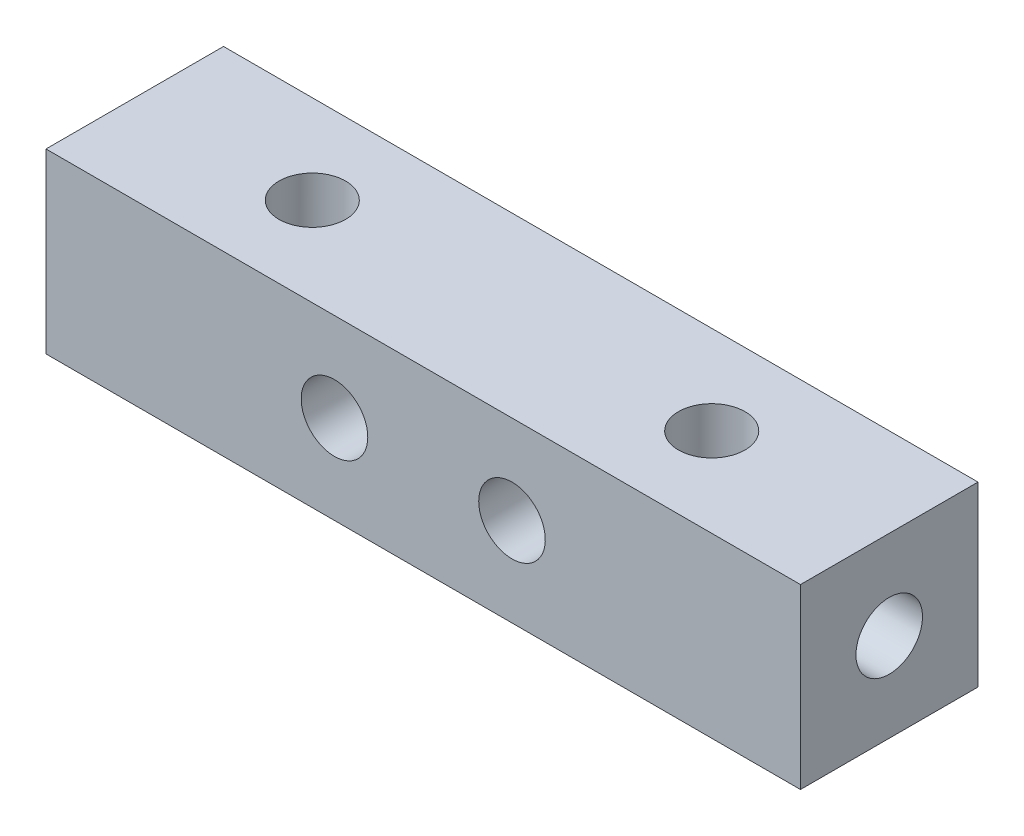
ISO-10303-21;
HEADER;
FILE_DESCRIPTION(('STEP AP214'),'2;1');
FILE_NAME('part.step','',(''),(''),'','','');
FILE_SCHEMA(('AUTOMOTIVE_DESIGN { 1 0 10303 214 1 1 1 1 }'));
ENDSEC;
DATA;
#1=APPLICATION_CONTEXT('core data for automotive mechanical design processes');
#2=APPLICATION_PROTOCOL_DEFINITION('international standard','automotive_design',2000,#1);
#3=PRODUCT_CONTEXT('',#1,'mechanical');
#4=PRODUCT('Part','Part','',(#3));
#5=PRODUCT_RELATED_PRODUCT_CATEGORY('part','',(#4));
#6=PRODUCT_DEFINITION_FORMATION('','',#4);
#7=PRODUCT_DEFINITION_CONTEXT('part definition',#1,'design');
#8=PRODUCT_DEFINITION('design','',#6,#7);
#9=PRODUCT_DEFINITION_SHAPE('','',#8);
#10=(LENGTH_UNIT() NAMED_UNIT(*) SI_UNIT(.MILLI.,.METRE.));
#11=(NAMED_UNIT(*) PLANE_ANGLE_UNIT() SI_UNIT($,.RADIAN.));
#12=(NAMED_UNIT(*) SI_UNIT($,.STERADIAN.) SOLID_ANGLE_UNIT());
#13=UNCERTAINTY_MEASURE_WITH_UNIT(LENGTH_MEASURE(1.E-05),#10,'distance_accuracy_value','');
#14=(GEOMETRIC_REPRESENTATION_CONTEXT(3) GLOBAL_UNCERTAINTY_ASSIGNED_CONTEXT((#13)) GLOBAL_UNIT_ASSIGNED_CONTEXT((#10,
#11,#12)) REPRESENTATION_CONTEXT('',''));
#15=CARTESIAN_POINT('',(0.,0.,0.));
#16=DIRECTION('',(0.,0.,1.));
#17=DIRECTION('',(1.,0.,0.));
#18=AXIS2_PLACEMENT_3D('',#15,#16,#17);
#19=CARTESIAN_POINT('',(-9.,8.,0.));
#20=DIRECTION('',(0.,-1.,0.));
#21=DIRECTION('',(0.,0.,-1.));
#22=AXIS2_PLACEMENT_3D('',#19,#20,#21);
#23=CYLINDRICAL_SURFACE('',#22,1.5);
#24=CARTESIAN_POINT('',(-9.,4.,0.));
#25=DIRECTION('',(-0.707106781186547,-0.707106781186547,0.));
#26=DIRECTION('',(0.707106781186547,-0.707106781186547,0.));
#27=AXIS2_PLACEMENT_3D('',#24,#25,#26);
#28=ELLIPSE('',#27,2.12132034355964,1.5);
#29=CARTESIAN_POINT('',(-9.,4.,-1.5));
#30=VERTEX_POINT('',#29);
#31=CARTESIAN_POINT('',(-9.,4.,1.5));
#32=VERTEX_POINT('',#31);
#33=EDGE_CURVE('E208',#30,#32,#28,.F.);
#34=ORIENTED_EDGE('',*,*,#33,.F.);
#35=CARTESIAN_POINT('',(-9.,4.,0.));
#36=DIRECTION('',(0.707106781186547,-0.707106781186547,0.));
#37=DIRECTION('',(-0.707106781186547,-0.707106781186547,0.));
#38=AXIS2_PLACEMENT_3D('',#35,#36,#37);
#39=ELLIPSE('',#38,2.12132034355964,1.5);
#40=EDGE_CURVE('E57',#32,#30,#39,.F.);
#41=ORIENTED_EDGE('',*,*,#40,.F.);
#42=EDGE_LOOP('',(#34,#41));
#43=FACE_BOUND('',#42,.T.);
#44=CARTESIAN_POINT('',(-9.,8.,0.));
#45=DIRECTION('',(0.,1.,0.));
#46=DIRECTION('',(0.,0.,1.));
#47=AXIS2_PLACEMENT_3D('',#44,#45,#46);
#48=CIRCLE('',#47,1.5);
#49=CARTESIAN_POINT('',(-9.,8.,1.5));
#50=VERTEX_POINT('',#49);
#51=EDGE_CURVE('E161',#50,#50,#48,.T.);
#52=ORIENTED_EDGE('',*,*,#51,.T.);
#53=EDGE_LOOP('',(#52));
#54=FACE_BOUND('',#53,.T.);
#55=ADVANCED_FACE('F42',(#43,#54),#23,.F.);
#56=CARTESIAN_POINT('',(9.,8.,0.));
#57=DIRECTION('',(0.,-1.,0.));
#58=DIRECTION('',(0.,0.,-1.));
#59=AXIS2_PLACEMENT_3D('',#56,#57,#58);
#60=CYLINDRICAL_SURFACE('',#59,1.5);
#61=CARTESIAN_POINT('',(9.,4.,0.));
#62=DIRECTION('',(-0.707106781186547,-0.707106781186547,0.));
#63=DIRECTION('',(0.707106781186547,-0.707106781186547,0.));
#64=AXIS2_PLACEMENT_3D('',#61,#62,#63);
#65=ELLIPSE('',#64,2.12132034355964,1.5);
#66=CARTESIAN_POINT('',(9.,4.,-1.5));
#67=VERTEX_POINT('',#66);
#68=CARTESIAN_POINT('',(9.,4.,1.5));
#69=VERTEX_POINT('',#68);
#70=EDGE_CURVE('E220',#67,#69,#65,.F.);
#71=ORIENTED_EDGE('',*,*,#70,.F.);
#72=CARTESIAN_POINT('',(9.,4.,0.));
#73=DIRECTION('',(0.707106781186547,-0.707106781186547,0.));
#74=DIRECTION('',(-0.707106781186547,-0.707106781186547,0.));
#75=AXIS2_PLACEMENT_3D('',#72,#73,#74);
#76=ELLIPSE('',#75,2.12132034355964,1.5);
#77=EDGE_CURVE('E64',#69,#67,#76,.F.);
#78=ORIENTED_EDGE('',*,*,#77,.F.);
#79=EDGE_LOOP('',(#71,#78));
#80=FACE_BOUND('',#79,.T.);
#81=CARTESIAN_POINT('',(9.,8.,0.));
#82=DIRECTION('',(0.,1.,0.));
#83=DIRECTION('',(0.,0.,1.));
#84=AXIS2_PLACEMENT_3D('',#81,#82,#83);
#85=CIRCLE('',#84,1.5);
#86=CARTESIAN_POINT('',(9.,8.,1.5));
#87=VERTEX_POINT('',#86);
#88=EDGE_CURVE('E177',#87,#87,#85,.T.);
#89=ORIENTED_EDGE('',*,*,#88,.T.);
#90=EDGE_LOOP('',(#89));
#91=FACE_BOUND('',#90,.T.);
#92=ADVANCED_FACE('F289',(#80,#91),#60,.F.);
#93=CARTESIAN_POINT('',(4.,4.,-4.));
#94=DIRECTION('',(0.,0.,1.));
#95=DIRECTION('',(1.,0.,0.));
#96=AXIS2_PLACEMENT_3D('',#93,#94,#95);
#97=CYLINDRICAL_SURFACE('',#96,1.5);
#98=CARTESIAN_POINT('',(4.,4.,4.));
#99=DIRECTION('',(0.,0.,1.));
#100=DIRECTION('',(-1.,0.,0.));
#101=AXIS2_PLACEMENT_3D('',#98,#99,#100);
#102=CIRCLE('',#101,1.5);
#103=CARTESIAN_POINT('',(2.5,4.,4.));
#104=VERTEX_POINT('',#103);
#105=EDGE_CURVE('E193',#104,#104,#102,.T.);
#106=ORIENTED_EDGE('',*,*,#105,.T.);
#107=EDGE_LOOP('',(#106));
#108=FACE_BOUND('',#107,.T.);
#109=CARTESIAN_POINT('',(4.,4.,0.));
#110=DIRECTION('',(0.707106781186547,0.,0.707106781186547));
#111=DIRECTION('',(-0.707106781186547,0.,0.707106781186547));
#112=AXIS2_PLACEMENT_3D('',#109,#110,#111);
#113=ELLIPSE('',#112,2.12132034355964,1.5);
#114=CARTESIAN_POINT('',(4.,2.5,0.));
#115=VERTEX_POINT('',#114);
#116=CARTESIAN_POINT('',(4.,5.5,0.));
#117=VERTEX_POINT('',#116);
#118=EDGE_CURVE('E244',#115,#117,#113,.F.);
#119=ORIENTED_EDGE('',*,*,#118,.T.);
#120=CARTESIAN_POINT('',(4.,4.,0.));
#121=DIRECTION('',(-0.707106781186547,0.,0.707106781186547));
#122=DIRECTION('',(0.707106781186547,0.,0.707106781186547));
#123=AXIS2_PLACEMENT_3D('',#120,#121,#122);
#124=ELLIPSE('',#123,2.12132034355964,1.5);
#125=EDGE_CURVE('E232',#117,#115,#124,.F.);
#126=ORIENTED_EDGE('',*,*,#125,.T.);
#127=EDGE_LOOP('',(#119,#126));
#128=FACE_BOUND('',#127,.T.);
#129=ADVANCED_FACE('F296',(#108,#128),#97,.F.);
#130=CARTESIAN_POINT('',(-4.,4.,-4.));
#131=DIRECTION('',(0.,0.,1.));
#132=DIRECTION('',(1.,0.,0.));
#133=AXIS2_PLACEMENT_3D('',#130,#131,#132);
#134=CYLINDRICAL_SURFACE('',#133,1.5);
#135=CARTESIAN_POINT('',(-4.,4.,4.));
#136=DIRECTION('',(0.,0.,1.));
#137=DIRECTION('',(1.,0.,0.));
#138=AXIS2_PLACEMENT_3D('',#135,#136,#137);
#139=CIRCLE('',#138,1.5);
#140=CARTESIAN_POINT('',(-2.5,4.,4.));
#141=VERTEX_POINT('',#140);
#142=EDGE_CURVE('E198',#141,#141,#139,.T.);
#143=ORIENTED_EDGE('',*,*,#142,.T.);
#144=EDGE_LOOP('',(#143));
#145=FACE_BOUND('',#144,.T.);
#146=CARTESIAN_POINT('',(-4.,4.,0.));
#147=DIRECTION('',(0.707106781186547,0.,0.707106781186547));
#148=DIRECTION('',(-0.707106781186547,0.,0.707106781186547));
#149=AXIS2_PLACEMENT_3D('',#146,#147,#148);
#150=ELLIPSE('',#149,2.12132034355964,1.5);
#151=CARTESIAN_POINT('',(-4.,2.5,0.));
#152=VERTEX_POINT('',#151);
#153=CARTESIAN_POINT('',(-4.,5.5,0.));
#154=VERTEX_POINT('',#153);
#155=EDGE_CURVE('E117',#152,#154,#150,.F.);
#156=ORIENTED_EDGE('',*,*,#155,.T.);
#157=CARTESIAN_POINT('',(-4.,4.,0.));
#158=DIRECTION('',(-0.707106781186547,0.,0.707106781186547));
#159=DIRECTION('',(0.707106781186547,0.,0.707106781186547));
#160=AXIS2_PLACEMENT_3D('',#157,#158,#159);
#161=ELLIPSE('',#160,2.12132034355964,1.5);
#162=EDGE_CURVE('E11',#154,#152,#161,.F.);
#163=ORIENTED_EDGE('',*,*,#162,.T.);
#164=EDGE_LOOP('',(#156,#163));
#165=FACE_BOUND('',#164,.T.);
#166=ADVANCED_FACE('F126',(#145,#165),#134,.F.);
#167=CARTESIAN_POINT('',(0.,8.,0.));
#168=DIRECTION('',(0.,-1.,0.));
#169=DIRECTION('',(0.,0.,-1.));
#170=AXIS2_PLACEMENT_3D('',#167,#168,#169);
#171=PLANE('',#170);
#172=DIRECTION('',(0.,0.,-1.));
#173=VECTOR('',#172,1.);
#174=CARTESIAN_POINT('',(17.,8.,4.));
#175=LINE('',#174,#173);
#176=CARTESIAN_POINT('',(17.,8.,4.));
#177=VERTEX_POINT('',#176);
#178=CARTESIAN_POINT('',(17.,8.,-4.));
#179=VERTEX_POINT('',#178);
#180=EDGE_CURVE('E150',#177,#179,#175,.T.);
#181=ORIENTED_EDGE('',*,*,#180,.T.);
#182=DIRECTION('',(-1.,0.,0.));
#183=VECTOR('',#182,1.);
#184=CARTESIAN_POINT('',(-17.,8.,-4.));
#185=LINE('',#184,#183);
#186=CARTESIAN_POINT('',(-17.,8.,-4.));
#187=VERTEX_POINT('',#186);
#188=EDGE_CURVE('E167',#179,#187,#185,.T.);
#189=ORIENTED_EDGE('',*,*,#188,.T.);
#190=DIRECTION('',(0.,0.,1.));
#191=VECTOR('',#190,1.);
#192=CARTESIAN_POINT('',(-17.,8.,4.));
#193=LINE('',#192,#191);
#194=CARTESIAN_POINT('',(-17.,8.,4.));
#195=VERTEX_POINT('',#194);
#196=EDGE_CURVE('E164',#187,#195,#193,.T.);
#197=ORIENTED_EDGE('',*,*,#196,.T.);
#198=DIRECTION('',(1.,0.,0.));
#199=VECTOR('',#198,1.);
#200=CARTESIAN_POINT('',(-17.,8.,4.));
#201=LINE('',#200,#199);
#202=EDGE_CURVE('E146',#195,#177,#201,.T.);
#203=ORIENTED_EDGE('',*,*,#202,.T.);
#204=EDGE_LOOP('',(#181,#189,#197,#203));
#205=FACE_BOUND('',#204,.T.);
#206=ORIENTED_EDGE('',*,*,#51,.F.);
#207=EDGE_LOOP('',(#206));
#208=FACE_BOUND('',#207,.T.);
#209=ORIENTED_EDGE('',*,*,#88,.F.);
#210=EDGE_LOOP('',(#209));
#211=FACE_BOUND('',#210,.T.);
#212=ADVANCED_FACE('F276',(#205,#208,#211),#171,.F.);
#213=CARTESIAN_POINT('',(0.,0.,0.));
#214=DIRECTION('',(0.,-1.,0.));
#215=DIRECTION('',(0.,0.,-1.));
#216=AXIS2_PLACEMENT_3D('',#213,#214,#215);
#217=PLANE('',#216);
#218=CARTESIAN_POINT('',(-9.,0.,0.));
#219=DIRECTION('',(0.,1.,0.));
#220=DIRECTION('',(0.,0.,1.));
#221=AXIS2_PLACEMENT_3D('',#218,#219,#220);
#222=CIRCLE('',#221,1.5);
#223=CARTESIAN_POINT('',(-9.,0.,1.5));
#224=VERTEX_POINT('',#223);
#225=EDGE_CURVE('E173',#224,#224,#222,.T.);
#226=ORIENTED_EDGE('',*,*,#225,.T.);
#227=EDGE_LOOP('',(#226));
#228=FACE_BOUND('',#227,.T.);
#229=DIRECTION('',(0.,0.,-1.));
#230=VECTOR('',#229,1.);
#231=CARTESIAN_POINT('',(17.,0.,4.));
#232=LINE('',#231,#230);
#233=CARTESIAN_POINT('',(17.,0.,4.));
#234=VERTEX_POINT('',#233);
#235=CARTESIAN_POINT('',(17.,0.,-4.));
#236=VERTEX_POINT('',#235);
#237=EDGE_CURVE('E157',#234,#236,#232,.T.);
#238=ORIENTED_EDGE('',*,*,#237,.F.);
#239=DIRECTION('',(1.,0.,0.));
#240=VECTOR('',#239,1.);
#241=CARTESIAN_POINT('',(-17.,0.,4.));
#242=LINE('',#241,#240);
#243=CARTESIAN_POINT('',(-17.,0.,4.));
#244=VERTEX_POINT('',#243);
#245=EDGE_CURVE('E147',#244,#234,#242,.T.);
#246=ORIENTED_EDGE('',*,*,#245,.F.);
#247=DIRECTION('',(0.,0.,1.));
#248=VECTOR('',#247,1.);
#249=CARTESIAN_POINT('',(-17.,0.,4.));
#250=LINE('',#249,#248);
#251=CARTESIAN_POINT('',(-17.,0.,-4.));
#252=VERTEX_POINT('',#251);
#253=EDGE_CURVE('E151',#252,#244,#250,.T.);
#254=ORIENTED_EDGE('',*,*,#253,.F.);
#255=DIRECTION('',(-1.,0.,0.));
#256=VECTOR('',#255,1.);
#257=CARTESIAN_POINT('',(-17.,0.,-4.));
#258=LINE('',#257,#256);
#259=EDGE_CURVE('E154',#236,#252,#258,.T.);
#260=ORIENTED_EDGE('',*,*,#259,.F.);
#261=EDGE_LOOP('',(#238,#246,#254,#260));
#262=FACE_BOUND('',#261,.T.);
#263=CARTESIAN_POINT('',(9.,0.,0.));
#264=DIRECTION('',(0.,1.,0.));
#265=DIRECTION('',(0.,0.,1.));
#266=AXIS2_PLACEMENT_3D('',#263,#264,#265);
#267=CIRCLE('',#266,1.5);
#268=CARTESIAN_POINT('',(9.,0.,1.5));
#269=VERTEX_POINT('',#268);
#270=EDGE_CURVE('E181',#269,#269,#267,.T.);
#271=ORIENTED_EDGE('',*,*,#270,.T.);
#272=EDGE_LOOP('',(#271));
#273=FACE_BOUND('',#272,.T.);
#274=ADVANCED_FACE('F270',(#228,#262,#273),#217,.T.);
#275=CARTESIAN_POINT('',(17.,8.,4.));
#276=DIRECTION('',(-1.,0.,0.));
#277=DIRECTION('',(0.,0.,1.));
#278=AXIS2_PLACEMENT_3D('',#275,#276,#277);
#279=PLANE('',#278);
#280=CARTESIAN_POINT('',(17.,4.,0.));
#281=DIRECTION('',(-1.,0.,0.));
#282=DIRECTION('',(0.,0.,1.));
#283=AXIS2_PLACEMENT_3D('',#280,#281,#282);
#284=CIRCLE('',#283,1.5);
#285=CARTESIAN_POINT('',(17.,4.,1.5));
#286=VERTEX_POINT('',#285);
#287=EDGE_CURVE('E194',#286,#286,#284,.T.);
#288=ORIENTED_EDGE('',*,*,#287,.T.);
#289=EDGE_LOOP('',(#288));
#290=FACE_BOUND('',#289,.T.);
#291=ORIENTED_EDGE('',*,*,#237,.T.);
#292=DIRECTION('',(0.,-1.,0.));
#293=VECTOR('',#292,1.);
#294=CARTESIAN_POINT('',(17.,8.,-4.));
#295=LINE('',#294,#293);
#296=EDGE_CURVE('E124',#179,#236,#295,.T.);
#297=ORIENTED_EDGE('',*,*,#296,.F.);
#298=ORIENTED_EDGE('',*,*,#180,.F.);
#299=DIRECTION('',(0.,-1.,0.));
#300=VECTOR('',#299,1.);
#301=CARTESIAN_POINT('',(17.,8.,4.));
#302=LINE('',#301,#300);
#303=EDGE_CURVE('E142',#177,#234,#302,.T.);
#304=ORIENTED_EDGE('',*,*,#303,.T.);
#305=EDGE_LOOP('',(#291,#297,#298,#304));
#306=FACE_BOUND('',#305,.T.);
#307=ADVANCED_FACE('F44',(#290,#306),#279,.F.);
#308=CARTESIAN_POINT('',(-17.,8.,-4.));
#309=DIRECTION('',(0.,0.,1.));
#310=DIRECTION('',(1.,0.,0.));
#311=AXIS2_PLACEMENT_3D('',#308,#309,#310);
#312=PLANE('',#311);
#313=CARTESIAN_POINT('',(-4.,4.,-4.));
#314=DIRECTION('',(0.,0.,1.));
#315=DIRECTION('',(1.,0.,0.));
#316=AXIS2_PLACEMENT_3D('',#313,#314,#315);
#317=CIRCLE('',#316,1.5);
#318=CARTESIAN_POINT('',(-2.5,4.,-4.));
#319=VERTEX_POINT('',#318);
#320=EDGE_CURVE('E185',#319,#319,#317,.T.);
#321=ORIENTED_EDGE('',*,*,#320,.T.);
#322=EDGE_LOOP('',(#321));
#323=FACE_BOUND('',#322,.T.);
#324=CARTESIAN_POINT('',(4.,4.,-4.));
#325=DIRECTION('',(0.,0.,1.));
#326=DIRECTION('',(-1.,0.,0.));
#327=AXIS2_PLACEMENT_3D('',#324,#325,#326);
#328=CIRCLE('',#327,1.5);
#329=CARTESIAN_POINT('',(2.5,4.,-4.));
#330=VERTEX_POINT('',#329);
#331=EDGE_CURVE('E189',#330,#330,#328,.T.);
#332=ORIENTED_EDGE('',*,*,#331,.T.);
#333=EDGE_LOOP('',(#332));
#334=FACE_BOUND('',#333,.T.);
#335=ORIENTED_EDGE('',*,*,#259,.T.);
#336=DIRECTION('',(0.,-1.,0.));
#337=VECTOR('',#336,1.);
#338=CARTESIAN_POINT('',(-17.,8.,-4.));
#339=LINE('',#338,#337);
#340=EDGE_CURVE('E134',#187,#252,#339,.T.);
#341=ORIENTED_EDGE('',*,*,#340,.F.);
#342=ORIENTED_EDGE('',*,*,#188,.F.);
#343=ORIENTED_EDGE('',*,*,#296,.T.);
#344=EDGE_LOOP('',(#335,#341,#342,#343));
#345=FACE_BOUND('',#344,.T.);
#346=ADVANCED_FACE('F258',(#323,#334,#345),#312,.F.);
#347=CARTESIAN_POINT('',(-17.,8.,4.));
#348=DIRECTION('',(1.,0.,0.));
#349=DIRECTION('',(0.,0.,-1.));
#350=AXIS2_PLACEMENT_3D('',#347,#348,#349);
#351=PLANE('',#350);
#352=CARTESIAN_POINT('',(-17.,4.,0.));
#353=DIRECTION('',(-1.,0.,0.));
#354=DIRECTION('',(0.,0.,1.));
#355=AXIS2_PLACEMENT_3D('',#352,#353,#354);
#356=CIRCLE('',#355,1.5);
#357=CARTESIAN_POINT('',(-17.,4.,1.5));
#358=VERTEX_POINT('',#357);
#359=EDGE_CURVE('E247',#358,#358,#356,.T.);
#360=ORIENTED_EDGE('',*,*,#359,.F.);
#361=EDGE_LOOP('',(#360));
#362=FACE_BOUND('',#361,.T.);
#363=ORIENTED_EDGE('',*,*,#253,.T.);
#364=DIRECTION('',(0.,-1.,0.));
#365=VECTOR('',#364,1.);
#366=CARTESIAN_POINT('',(-17.,8.,4.));
#367=LINE('',#366,#365);
#368=EDGE_CURVE('E138',#195,#244,#367,.T.);
#369=ORIENTED_EDGE('',*,*,#368,.F.);
#370=ORIENTED_EDGE('',*,*,#196,.F.);
#371=ORIENTED_EDGE('',*,*,#340,.T.);
#372=EDGE_LOOP('',(#363,#369,#370,#371));
#373=FACE_BOUND('',#372,.T.);
#374=ADVANCED_FACE('F254',(#362,#373),#351,.F.);
#375=CARTESIAN_POINT('',(-17.,8.,4.));
#376=DIRECTION('',(0.,0.,-1.));
#377=DIRECTION('',(-1.,0.,0.));
#378=AXIS2_PLACEMENT_3D('',#375,#376,#377);
#379=PLANE('',#378);
#380=ORIENTED_EDGE('',*,*,#142,.F.);
#381=EDGE_LOOP('',(#380));
#382=FACE_BOUND('',#381,.T.);
#383=ORIENTED_EDGE('',*,*,#105,.F.);
#384=EDGE_LOOP('',(#383));
#385=FACE_BOUND('',#384,.T.);
#386=ORIENTED_EDGE('',*,*,#245,.T.);
#387=ORIENTED_EDGE('',*,*,#303,.F.);
#388=ORIENTED_EDGE('',*,*,#202,.F.);
#389=ORIENTED_EDGE('',*,*,#368,.T.);
#390=EDGE_LOOP('',(#386,#387,#388,#389));
#391=FACE_BOUND('',#390,.T.);
#392=ADVANCED_FACE('F257',(#382,#385,#391),#379,.F.);
#393=CARTESIAN_POINT('',(-9.,4.,0.));
#394=DIRECTION('',(-0.707106781186547,-0.707106781186547,0.));
#395=DIRECTION('',(0.707106781186547,-0.707106781186547,0.));
#396=AXIS2_PLACEMENT_3D('',#393,#394,#395);
#397=ELLIPSE('',#396,2.12132034355964,1.5);
#398=EDGE_CURVE('E212',#30,#32,#397,.T.);
#399=ORIENTED_EDGE('',*,*,#398,.F.);
#400=CARTESIAN_POINT('',(-9.,4.,0.));
#401=DIRECTION('',(0.707106781186547,-0.707106781186547,0.));
#402=DIRECTION('',(-0.707106781186547,-0.707106781186547,0.));
#403=AXIS2_PLACEMENT_3D('',#400,#401,#402);
#404=ELLIPSE('',#403,2.12132034355964,1.5);
#405=EDGE_CURVE('E215',#32,#30,#404,.T.);
#406=ORIENTED_EDGE('',*,*,#405,.F.);
#407=EDGE_LOOP('',(#399,#406));
#408=FACE_BOUND('',#407,.T.);
#409=ORIENTED_EDGE('',*,*,#225,.F.);
#410=EDGE_LOOP('',(#409));
#411=FACE_BOUND('',#410,.T.);
#412=ADVANCED_FACE('F291',(#408,#411),#23,.F.);
#413=CARTESIAN_POINT('',(9.,4.,0.));
#414=DIRECTION('',(-0.707106781186547,-0.707106781186547,0.));
#415=DIRECTION('',(0.707106781186547,-0.707106781186547,0.));
#416=AXIS2_PLACEMENT_3D('',#413,#414,#415);
#417=ELLIPSE('',#416,2.12132034355964,1.5);
#418=EDGE_CURVE('E224',#67,#69,#417,.T.);
#419=ORIENTED_EDGE('',*,*,#418,.F.);
#420=CARTESIAN_POINT('',(9.,4.,0.));
#421=DIRECTION('',(0.707106781186547,-0.707106781186547,0.));
#422=DIRECTION('',(-0.707106781186547,-0.707106781186547,0.));
#423=AXIS2_PLACEMENT_3D('',#420,#421,#422);
#424=ELLIPSE('',#423,2.12132034355964,1.5);
#425=EDGE_CURVE('E227',#69,#67,#424,.T.);
#426=ORIENTED_EDGE('',*,*,#425,.F.);
#427=EDGE_LOOP('',(#419,#426));
#428=FACE_BOUND('',#427,.T.);
#429=ORIENTED_EDGE('',*,*,#270,.F.);
#430=EDGE_LOOP('',(#429));
#431=FACE_BOUND('',#430,.T.);
#432=ADVANCED_FACE('F298',(#428,#431),#60,.F.);
#433=CARTESIAN_POINT('',(4.,4.,0.));
#434=DIRECTION('',(0.707106781186547,0.,0.707106781186547));
#435=DIRECTION('',(-0.707106781186547,0.,0.707106781186547));
#436=AXIS2_PLACEMENT_3D('',#433,#434,#435);
#437=ELLIPSE('',#436,2.12132034355964,1.5);
#438=EDGE_CURVE('E240',#115,#117,#437,.T.);
#439=ORIENTED_EDGE('',*,*,#438,.T.);
#440=CARTESIAN_POINT('',(4.,4.,0.));
#441=DIRECTION('',(-0.707106781186547,0.,0.707106781186547));
#442=DIRECTION('',(0.707106781186547,0.,0.707106781186547));
#443=AXIS2_PLACEMENT_3D('',#440,#441,#442);
#444=ELLIPSE('',#443,2.12132034355964,1.5);
#445=EDGE_CURVE('E236',#117,#115,#444,.T.);
#446=ORIENTED_EDGE('',*,*,#445,.T.);
#447=EDGE_LOOP('',(#439,#446));
#448=FACE_BOUND('',#447,.T.);
#449=ORIENTED_EDGE('',*,*,#331,.F.);
#450=EDGE_LOOP('',(#449));
#451=FACE_BOUND('',#450,.T.);
#452=ADVANCED_FACE('F306',(#448,#451),#97,.F.);
#453=CARTESIAN_POINT('',(-4.,4.,0.));
#454=DIRECTION('',(0.707106781186547,0.,0.707106781186547));
#455=DIRECTION('',(-0.707106781186547,0.,0.707106781186547));
#456=AXIS2_PLACEMENT_3D('',#453,#454,#455);
#457=ELLIPSE('',#456,2.12132034355964,1.5);
#458=EDGE_CURVE('E110',#152,#154,#457,.T.);
#459=ORIENTED_EDGE('',*,*,#458,.T.);
#460=CARTESIAN_POINT('',(-4.,4.,0.));
#461=DIRECTION('',(-0.707106781186547,0.,0.707106781186547));
#462=DIRECTION('',(0.707106781186547,0.,0.707106781186547));
#463=AXIS2_PLACEMENT_3D('',#460,#461,#462);
#464=ELLIPSE('',#463,2.12132034355964,1.5);
#465=EDGE_CURVE('E51',#154,#152,#464,.T.);
#466=ORIENTED_EDGE('',*,*,#465,.T.);
#467=EDGE_LOOP('',(#459,#466));
#468=FACE_BOUND('',#467,.T.);
#469=ORIENTED_EDGE('',*,*,#320,.F.);
#470=EDGE_LOOP('',(#469));
#471=FACE_BOUND('',#470,.T.);
#472=ADVANCED_FACE('F127',(#468,#471),#134,.F.);
#473=CARTESIAN_POINT('',(22.,4.,0.));
#474=DIRECTION('',(-1.,0.,0.));
#475=DIRECTION('',(0.,0.,1.));
#476=AXIS2_PLACEMENT_3D('',#473,#474,#475);
#477=CYLINDRICAL_SURFACE('',#476,1.5);
#478=ORIENTED_EDGE('',*,*,#398,.T.);
#479=ORIENTED_EDGE('',*,*,#40,.T.);
#480=EDGE_LOOP('',(#478,#479));
#481=FACE_BOUND('',#480,.T.);
#482=ORIENTED_EDGE('',*,*,#155,.F.);
#483=ORIENTED_EDGE('',*,*,#465,.F.);
#484=EDGE_LOOP('',(#482,#483));
#485=FACE_BOUND('',#484,.T.);
#486=ADVANCED_FACE('F121',(#481,#485),#477,.F.);
#487=ORIENTED_EDGE('',*,*,#458,.F.);
#488=ORIENTED_EDGE('',*,*,#162,.F.);
#489=EDGE_LOOP('',(#487,#488));
#490=FACE_BOUND('',#489,.T.);
#491=ORIENTED_EDGE('',*,*,#118,.F.);
#492=ORIENTED_EDGE('',*,*,#445,.F.);
#493=EDGE_LOOP('',(#491,#492));
#494=FACE_BOUND('',#493,.T.);
#495=ADVANCED_FACE('F112',(#490,#494),#477,.F.);
#496=ORIENTED_EDGE('',*,*,#70,.T.);
#497=ORIENTED_EDGE('',*,*,#425,.T.);
#498=EDGE_LOOP('',(#496,#497));
#499=FACE_BOUND('',#498,.T.);
#500=ORIENTED_EDGE('',*,*,#438,.F.);
#501=ORIENTED_EDGE('',*,*,#125,.F.);
#502=EDGE_LOOP('',(#500,#501));
#503=FACE_BOUND('',#502,.T.);
#504=ADVANCED_FACE('F339',(#499,#503),#477,.F.);
#505=ORIENTED_EDGE('',*,*,#418,.T.);
#506=ORIENTED_EDGE('',*,*,#77,.T.);
#507=EDGE_LOOP('',(#505,#506));
#508=FACE_BOUND('',#507,.T.);
#509=ORIENTED_EDGE('',*,*,#287,.F.);
#510=EDGE_LOOP('',(#509));
#511=FACE_BOUND('',#510,.T.);
#512=ADVANCED_FACE('F340',(#508,#511),#477,.F.);
#513=ORIENTED_EDGE('',*,*,#33,.T.);
#514=ORIENTED_EDGE('',*,*,#405,.T.);
#515=EDGE_LOOP('',(#513,#514));
#516=FACE_BOUND('',#515,.T.);
#517=ORIENTED_EDGE('',*,*,#359,.T.);
#518=EDGE_LOOP('',(#517));
#519=FACE_BOUND('',#518,.T.);
#520=ADVANCED_FACE('F252',(#516,#519),#477,.F.);
#521=CLOSED_SHELL('',(#55,#92,#129,#166,#212,#274,#307,#346,#374,#392,#412,#432,#452,#472,#486,
#495,#504,#512,#520));
#522=MANIFOLD_SOLID_BREP('B2',#521);
#523=ADVANCED_BREP_SHAPE_REPRESENTATION('',(#18,#522),#14);
#524=SHAPE_DEFINITION_REPRESENTATION(#9,#523);
ENDSEC;
END-ISO-10303-21;
